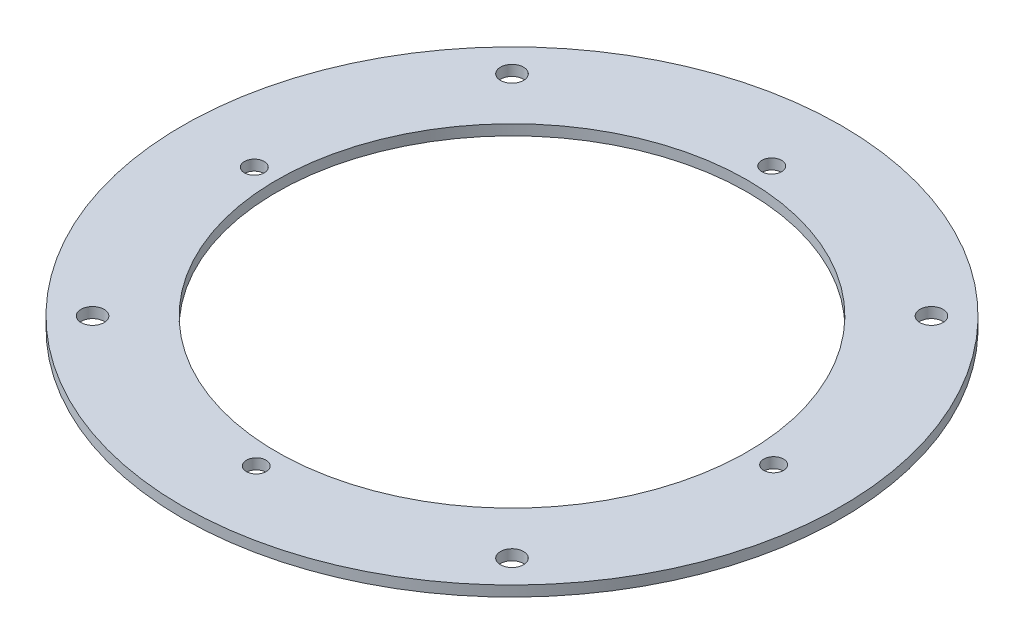
ISO-10303-21;
HEADER;
FILE_DESCRIPTION(('STEP AP214'),'2;1');
FILE_NAME('part.step','',(''),(''),'','','');
FILE_SCHEMA(('AUTOMOTIVE_DESIGN { 1 0 10303 214 1 1 1 1 }'));
ENDSEC;
DATA;
#1=APPLICATION_CONTEXT('core data for automotive mechanical design processes');
#2=APPLICATION_PROTOCOL_DEFINITION('international standard','automotive_design',2000,#1);
#3=PRODUCT_CONTEXT('',#1,'mechanical');
#4=PRODUCT('Part','Part','',(#3));
#5=PRODUCT_RELATED_PRODUCT_CATEGORY('part','',(#4));
#6=PRODUCT_DEFINITION_FORMATION('','',#4);
#7=PRODUCT_DEFINITION_CONTEXT('part definition',#1,'design');
#8=PRODUCT_DEFINITION('design','',#6,#7);
#9=PRODUCT_DEFINITION_SHAPE('','',#8);
#10=(LENGTH_UNIT() NAMED_UNIT(*) SI_UNIT(.MILLI.,.METRE.));
#11=(NAMED_UNIT(*) PLANE_ANGLE_UNIT() SI_UNIT($,.RADIAN.));
#12=(NAMED_UNIT(*) SI_UNIT($,.STERADIAN.) SOLID_ANGLE_UNIT());
#13=UNCERTAINTY_MEASURE_WITH_UNIT(LENGTH_MEASURE(1.E-05),#10,'distance_accuracy_value','');
#14=(GEOMETRIC_REPRESENTATION_CONTEXT(3) GLOBAL_UNCERTAINTY_ASSIGNED_CONTEXT((#13)) GLOBAL_UNIT_ASSIGNED_CONTEXT((#10,
#11,#12)) REPRESENTATION_CONTEXT('',''));
#15=CARTESIAN_POINT('',(0.,0.,0.));
#16=DIRECTION('',(0.,0.,1.));
#17=DIRECTION('',(1.,0.,0.));
#18=AXIS2_PLACEMENT_3D('',#15,#16,#17);
#19=CARTESIAN_POINT('',(0.,1.59,0.));
#20=DIRECTION('',(0.,1.,0.));
#21=DIRECTION('',(0.,0.,1.));
#22=AXIS2_PLACEMENT_3D('',#19,#20,#21);
#23=PLANE('',#22);
#24=CARTESIAN_POINT('',(31.8198103067884,1.59,-31.8198000000018));
#25=DIRECTION('',(0.,1.,0.));
#26=DIRECTION('',(0.,0.,1.));
#27=AXIS2_PLACEMENT_3D('',#24,#25,#26);
#28=CIRCLE('',#27,1.75000000000186);
#29=CARTESIAN_POINT('',(31.8198103067884,1.59,-30.0697999999999));
#30=VERTEX_POINT('',#29);
#31=EDGE_CURVE('E71',#30,#30,#28,.T.);
#32=ORIENTED_EDGE('',*,*,#31,.F.);
#33=EDGE_LOOP('',(#32));
#34=FACE_BOUND('',#33,.T.);
#35=CARTESIAN_POINT('',(31.8198000000018,1.59,31.8198103067866));
#36=DIRECTION('',(0.,1.,0.));
#37=DIRECTION('',(0.,0.,1.));
#38=AXIS2_PLACEMENT_3D('',#35,#36,#37);
#39=CIRCLE('',#38,1.75000000000253);
#40=CARTESIAN_POINT('',(31.8198000000018,1.59,33.5698103067892));
#41=VERTEX_POINT('',#40);
#42=EDGE_CURVE('E126',#41,#41,#39,.T.);
#43=ORIENTED_EDGE('',*,*,#42,.F.);
#44=EDGE_LOOP('',(#43));
#45=FACE_BOUND('',#44,.T.);
#46=CARTESIAN_POINT('',(-31.8198103067866,1.59,31.8198));
#47=DIRECTION('',(0.,1.,0.));
#48=DIRECTION('',(0.,0.,1.));
#49=AXIS2_PLACEMENT_3D('',#46,#47,#48);
#50=CIRCLE('',#49,1.75000000000097);
#51=CARTESIAN_POINT('',(-31.8198103067866,1.59,33.569800000001));
#52=VERTEX_POINT('',#51);
#53=EDGE_CURVE('E84',#52,#52,#50,.T.);
#54=ORIENTED_EDGE('',*,*,#53,.F.);
#55=EDGE_LOOP('',(#54));
#56=FACE_BOUND('',#55,.T.);
#57=CARTESIAN_POINT('',(-31.8198,1.59,-31.8198103067884));
#58=DIRECTION('',(0.,1.,0.));
#59=DIRECTION('',(0.,0.,1.));
#60=AXIS2_PLACEMENT_3D('',#57,#58,#59);
#61=CIRCLE('',#60,1.75);
#62=CARTESIAN_POINT('',(-31.8198,1.59,-30.0698103067884));
#63=VERTEX_POINT('',#62);
#64=EDGE_CURVE('E67',#63,#63,#61,.T.);
#65=ORIENTED_EDGE('',*,*,#64,.F.);
#66=EDGE_LOOP('',(#65));
#67=FACE_BOUND('',#66,.T.);
#68=CARTESIAN_POINT('',(39.4,1.59,-0.3000000000011));
#69=DIRECTION('',(0.,1.,0.));
#70=DIRECTION('',(0.,0.,1.));
#71=AXIS2_PLACEMENT_3D('',#68,#69,#70);
#72=CIRCLE('',#71,1.5);
#73=CARTESIAN_POINT('',(39.4,1.59,1.1999999999989));
#74=VERTEX_POINT('',#73);
#75=EDGE_CURVE('E57',#74,#74,#72,.T.);
#76=ORIENTED_EDGE('',*,*,#75,.F.);
#77=EDGE_LOOP('',(#76));
#78=FACE_BOUND('',#77,.T.);
#79=CARTESIAN_POINT('',(0.300000000001114,1.59,39.0999999999989));
#80=DIRECTION('',(0.,1.,0.));
#81=DIRECTION('',(0.,0.,1.));
#82=AXIS2_PLACEMENT_3D('',#79,#80,#81);
#83=CIRCLE('',#82,1.5);
#84=CARTESIAN_POINT('',(0.300000000001114,1.59,40.5999999999989));
#85=VERTEX_POINT('',#84);
#86=EDGE_CURVE('E88',#85,#85,#83,.T.);
#87=ORIENTED_EDGE('',*,*,#86,.F.);
#88=EDGE_LOOP('',(#87));
#89=FACE_BOUND('',#88,.T.);
#90=CARTESIAN_POINT('',(-39.0999999999989,1.59,0.));
#91=DIRECTION('',(0.,1.,0.));
#92=DIRECTION('',(0.,0.,1.));
#93=AXIS2_PLACEMENT_3D('',#90,#91,#92);
#94=CIRCLE('',#93,1.5);
#95=CARTESIAN_POINT('',(-39.0999999999989,1.59,1.5));
#96=VERTEX_POINT('',#95);
#97=EDGE_CURVE('E66',#96,#96,#94,.T.);
#98=ORIENTED_EDGE('',*,*,#97,.F.);
#99=EDGE_LOOP('',(#98));
#100=FACE_BOUND('',#99,.T.);
#101=CARTESIAN_POINT('',(0.,1.59,-39.4));
#102=DIRECTION('',(0.,1.,0.));
#103=DIRECTION('',(0.,0.,1.));
#104=AXIS2_PLACEMENT_3D('',#101,#102,#103);
#105=CIRCLE('',#104,1.5);
#106=CARTESIAN_POINT('',(0.,1.59,-37.9));
#107=VERTEX_POINT('',#106);
#108=EDGE_CURVE('E52',#107,#107,#105,.T.);
#109=ORIENTED_EDGE('',*,*,#108,.F.);
#110=EDGE_LOOP('',(#109));
#111=FACE_BOUND('',#110,.T.);
#112=CARTESIAN_POINT('',(0.,1.59,0.));
#113=DIRECTION('',(0.,1.,0.));
#114=DIRECTION('',(0.,0.,1.));
#115=AXIS2_PLACEMENT_3D('',#112,#113,#114);
#116=CIRCLE('',#115,50.);
#117=CARTESIAN_POINT('',(0.,1.59,-50.));
#118=VERTEX_POINT('',#117);
#119=EDGE_CURVE('E10',#118,#118,#116,.T.);
#120=ORIENTED_EDGE('',*,*,#119,.T.);
#121=EDGE_LOOP('',(#120));
#122=FACE_BOUND('',#121,.T.);
#123=CARTESIAN_POINT('',(0.,1.59,0.));
#124=DIRECTION('',(0.,1.,0.));
#125=DIRECTION('',(0.,0.,1.));
#126=AXIS2_PLACEMENT_3D('',#123,#124,#125);
#127=CIRCLE('',#126,35.715);
#128=CARTESIAN_POINT('',(0.,1.59,-35.715));
#129=VERTEX_POINT('',#128);
#130=EDGE_CURVE('E43',#129,#129,#127,.T.);
#131=ORIENTED_EDGE('',*,*,#130,.F.);
#132=EDGE_LOOP('',(#131));
#133=FACE_BOUND('',#132,.T.);
#134=ADVANCED_FACE('F30',(#34,#45,#56,#67,#78,#89,#100,#111,#122,#133),#23,.T.);
#135=CARTESIAN_POINT('',(0.,0.,0.));
#136=DIRECTION('',(0.,1.,0.));
#137=DIRECTION('',(0.,0.,1.));
#138=AXIS2_PLACEMENT_3D('',#135,#136,#137);
#139=PLANE('',#138);
#140=CARTESIAN_POINT('',(31.8198103067884,0.,-31.8198000000018));
#141=DIRECTION('',(0.,1.,0.));
#142=DIRECTION('',(0.,0.,1.));
#143=AXIS2_PLACEMENT_3D('',#140,#141,#142);
#144=CIRCLE('',#143,1.75000000000186);
#145=CARTESIAN_POINT('',(31.8198103067884,0.,-30.0697999999999));
#146=VERTEX_POINT('',#145);
#147=EDGE_CURVE('E34',#146,#146,#144,.T.);
#148=ORIENTED_EDGE('',*,*,#147,.T.);
#149=EDGE_LOOP('',(#148));
#150=FACE_BOUND('',#149,.T.);
#151=CARTESIAN_POINT('',(31.8198000000018,0.,31.8198103067866));
#152=DIRECTION('',(0.,1.,0.));
#153=DIRECTION('',(0.,0.,1.));
#154=AXIS2_PLACEMENT_3D('',#151,#152,#153);
#155=CIRCLE('',#154,1.75000000000253);
#156=CARTESIAN_POINT('',(31.8198000000018,0.,33.5698103067892));
#157=VERTEX_POINT('',#156);
#158=EDGE_CURVE('E70',#157,#157,#155,.T.);
#159=ORIENTED_EDGE('',*,*,#158,.T.);
#160=EDGE_LOOP('',(#159));
#161=FACE_BOUND('',#160,.T.);
#162=CARTESIAN_POINT('',(-31.8198103067866,0.,31.8198));
#163=DIRECTION('',(0.,1.,0.));
#164=DIRECTION('',(0.,0.,1.));
#165=AXIS2_PLACEMENT_3D('',#162,#163,#164);
#166=CIRCLE('',#165,1.75000000000097);
#167=CARTESIAN_POINT('',(-31.8198103067866,0.,33.569800000001));
#168=VERTEX_POINT('',#167);
#169=EDGE_CURVE('E68',#168,#168,#166,.T.);
#170=ORIENTED_EDGE('',*,*,#169,.T.);
#171=EDGE_LOOP('',(#170));
#172=FACE_BOUND('',#171,.T.);
#173=CARTESIAN_POINT('',(-31.8198,0.,-31.8198103067884));
#174=DIRECTION('',(0.,1.,0.));
#175=DIRECTION('',(0.,0.,1.));
#176=AXIS2_PLACEMENT_3D('',#173,#174,#175);
#177=CIRCLE('',#176,1.75);
#178=CARTESIAN_POINT('',(-31.8198,0.,-30.0698103067884));
#179=VERTEX_POINT('',#178);
#180=EDGE_CURVE('E63',#179,#179,#177,.T.);
#181=ORIENTED_EDGE('',*,*,#180,.T.);
#182=EDGE_LOOP('',(#181));
#183=FACE_BOUND('',#182,.T.);
#184=CARTESIAN_POINT('',(39.4,0.,-0.3000000000011));
#185=DIRECTION('',(0.,1.,0.));
#186=DIRECTION('',(0.,0.,1.));
#187=AXIS2_PLACEMENT_3D('',#184,#185,#186);
#188=CIRCLE('',#187,1.5);
#189=CARTESIAN_POINT('',(39.4,0.,1.1999999999989));
#190=VERTEX_POINT('',#189);
#191=EDGE_CURVE('E60',#190,#190,#188,.T.);
#192=ORIENTED_EDGE('',*,*,#191,.T.);
#193=EDGE_LOOP('',(#192));
#194=FACE_BOUND('',#193,.T.);
#195=CARTESIAN_POINT('',(0.300000000001114,0.,39.0999999999989));
#196=DIRECTION('',(0.,1.,0.));
#197=DIRECTION('',(0.,0.,1.));
#198=AXIS2_PLACEMENT_3D('',#195,#196,#197);
#199=CIRCLE('',#198,1.5);
#200=CARTESIAN_POINT('',(0.300000000001114,0.,40.5999999999989));
#201=VERTEX_POINT('',#200);
#202=EDGE_CURVE('E56',#201,#201,#199,.T.);
#203=ORIENTED_EDGE('',*,*,#202,.T.);
#204=EDGE_LOOP('',(#203));
#205=FACE_BOUND('',#204,.T.);
#206=CARTESIAN_POINT('',(-39.0999999999989,0.,0.));
#207=DIRECTION('',(0.,1.,0.));
#208=DIRECTION('',(0.,0.,1.));
#209=AXIS2_PLACEMENT_3D('',#206,#207,#208);
#210=CIRCLE('',#209,1.5);
#211=CARTESIAN_POINT('',(-39.0999999999989,0.,1.5));
#212=VERTEX_POINT('',#211);
#213=EDGE_CURVE('E53',#212,#212,#210,.T.);
#214=ORIENTED_EDGE('',*,*,#213,.T.);
#215=EDGE_LOOP('',(#214));
#216=FACE_BOUND('',#215,.T.);
#217=CARTESIAN_POINT('',(0.,0.,-39.4));
#218=DIRECTION('',(0.,1.,0.));
#219=DIRECTION('',(0.,0.,1.));
#220=AXIS2_PLACEMENT_3D('',#217,#218,#219);
#221=CIRCLE('',#220,1.5);
#222=CARTESIAN_POINT('',(0.,0.,-37.9));
#223=VERTEX_POINT('',#222);
#224=EDGE_CURVE('E49',#223,#223,#221,.T.);
#225=ORIENTED_EDGE('',*,*,#224,.T.);
#226=EDGE_LOOP('',(#225));
#227=FACE_BOUND('',#226,.T.);
#228=CARTESIAN_POINT('',(0.,0.,0.));
#229=DIRECTION('',(0.,1.,0.));
#230=DIRECTION('',(0.,0.,1.));
#231=AXIS2_PLACEMENT_3D('',#228,#229,#230);
#232=CIRCLE('',#231,50.);
#233=CARTESIAN_POINT('',(0.,0.,-50.));
#234=VERTEX_POINT('',#233);
#235=EDGE_CURVE('E38',#234,#234,#232,.T.);
#236=ORIENTED_EDGE('',*,*,#235,.F.);
#237=EDGE_LOOP('',(#236));
#238=FACE_BOUND('',#237,.T.);
#239=CARTESIAN_POINT('',(0.,0.,0.));
#240=DIRECTION('',(0.,1.,0.));
#241=DIRECTION('',(0.,0.,1.));
#242=AXIS2_PLACEMENT_3D('',#239,#240,#241);
#243=CIRCLE('',#242,35.715);
#244=CARTESIAN_POINT('',(0.,0.,-35.715));
#245=VERTEX_POINT('',#244);
#246=EDGE_CURVE('E46',#245,#245,#243,.T.);
#247=ORIENTED_EDGE('',*,*,#246,.T.);
#248=EDGE_LOOP('',(#247));
#249=FACE_BOUND('',#248,.T.);
#250=ADVANCED_FACE('F100',(#150,#161,#172,#183,#194,#205,#216,#227,#238,#249),#139,.F.);
#251=CARTESIAN_POINT('',(0.,1.59,0.));
#252=DIRECTION('',(0.,-1.,0.));
#253=DIRECTION('',(0.,0.,-1.));
#254=AXIS2_PLACEMENT_3D('',#251,#252,#253);
#255=CYLINDRICAL_SURFACE('',#254,50.);
#256=CARTESIAN_POINT('',(0.,1.59,-50.));
#257=CARTESIAN_POINT('',(0.,1.5734375,-50.));
#258=CARTESIAN_POINT('',(0.,1.556875,-50.));
#259=CARTESIAN_POINT('',(0.,1.52375,-50.));
#260=CARTESIAN_POINT('',(0.,1.5071875,-50.));
#261=CARTESIAN_POINT('',(0.,1.4740625,-50.));
#262=CARTESIAN_POINT('',(0.,1.4575,-50.));
#263=CARTESIAN_POINT('',(0.,1.424375,-50.));
#264=CARTESIAN_POINT('',(0.,1.4078125,-50.));
#265=CARTESIAN_POINT('',(0.,1.3746875,-50.));
#266=CARTESIAN_POINT('',(0.,1.358125,-50.));
#267=CARTESIAN_POINT('',(0.,1.325,-50.));
#268=CARTESIAN_POINT('',(0.,1.3084375,-50.));
#269=CARTESIAN_POINT('',(0.,1.2753125,-50.));
#270=CARTESIAN_POINT('',(0.,1.25875,-50.));
#271=CARTESIAN_POINT('',(0.,1.225625,-50.));
#272=CARTESIAN_POINT('',(0.,1.2090625,-50.));
#273=CARTESIAN_POINT('',(0.,1.1759375,-50.));
#274=CARTESIAN_POINT('',(0.,1.159375,-50.));
#275=CARTESIAN_POINT('',(0.,1.12625,-50.));
#276=CARTESIAN_POINT('',(0.,1.1096875,-50.));
#277=CARTESIAN_POINT('',(0.,1.0765625,-50.));
#278=CARTESIAN_POINT('',(0.,1.06,-50.));
#279=CARTESIAN_POINT('',(0.,1.026875,-50.));
#280=CARTESIAN_POINT('',(0.,1.0103125,-50.));
#281=CARTESIAN_POINT('',(0.,0.9771875,-50.));
#282=CARTESIAN_POINT('',(0.,0.960625,-50.));
#283=CARTESIAN_POINT('',(0.,0.9275,-50.));
#284=CARTESIAN_POINT('',(0.,0.9109375,-50.));
#285=CARTESIAN_POINT('',(0.,0.8778125,-50.));
#286=CARTESIAN_POINT('',(0.,0.86125,-50.));
#287=CARTESIAN_POINT('',(0.,0.828125,-50.));
#288=CARTESIAN_POINT('',(0.,0.8115625,-50.));
#289=CARTESIAN_POINT('',(0.,0.7784375,-50.));
#290=CARTESIAN_POINT('',(0.,0.761875,-50.));
#291=CARTESIAN_POINT('',(0.,0.72875,-50.));
#292=CARTESIAN_POINT('',(0.,0.7121875,-50.));
#293=CARTESIAN_POINT('',(0.,0.6790625,-50.));
#294=CARTESIAN_POINT('',(0.,0.6625,-50.));
#295=CARTESIAN_POINT('',(0.,0.629375,-50.));
#296=CARTESIAN_POINT('',(0.,0.6128125,-50.));
#297=CARTESIAN_POINT('',(0.,0.5796875,-50.));
#298=CARTESIAN_POINT('',(0.,0.563125,-50.));
#299=CARTESIAN_POINT('',(0.,0.53,-50.));
#300=CARTESIAN_POINT('',(0.,0.5134375,-50.));
#301=CARTESIAN_POINT('',(0.,0.4803125,-50.));
#302=CARTESIAN_POINT('',(0.,0.46375,-50.));
#303=CARTESIAN_POINT('',(0.,0.430625,-50.));
#304=CARTESIAN_POINT('',(0.,0.4140625,-50.));
#305=CARTESIAN_POINT('',(0.,0.3809375,-50.));
#306=CARTESIAN_POINT('',(0.,0.364375,-50.));
#307=CARTESIAN_POINT('',(0.,0.33125,-50.));
#308=CARTESIAN_POINT('',(0.,0.3146875,-50.));
#309=CARTESIAN_POINT('',(0.,0.2815625,-50.));
#310=CARTESIAN_POINT('',(0.,0.265,-50.));
#311=CARTESIAN_POINT('',(0.,0.231875,-50.));
#312=CARTESIAN_POINT('',(0.,0.2153125,-50.));
#313=CARTESIAN_POINT('',(0.,0.1821875,-50.));
#314=CARTESIAN_POINT('',(0.,0.165625,-50.));
#315=CARTESIAN_POINT('',(0.,0.1325,-50.));
#316=CARTESIAN_POINT('',(0.,0.1159375,-50.));
#317=CARTESIAN_POINT('',(0.,0.0828125000000001,-50.));
#318=CARTESIAN_POINT('',(0.,0.06625,-50.));
#319=CARTESIAN_POINT('',(0.,0.033125,-50.));
#320=CARTESIAN_POINT('',(0.,0.0165625,-50.));
#321=CARTESIAN_POINT('',(0.,0.,-50.));
#322=B_SPLINE_CURVE_WITH_KNOTS('',3,(#256,#257,#258,#259,#260,#261,#262,#263,#264,#265,#266,
#267,#268,#269,#270,#271,#272,#273,#274,#275,#276,#277,#278,#279,#280,#281,#282,#283,#284,#285,
#286,#287,#288,#289,#290,#291,#292,#293,#294,#295,#296,#297,#298,#299,#300,#301,#302,#303,#304,
#305,#306,#307,#308,#309,#310,#311,#312,#313,#314,#315,#316,#317,#318,#319,#320,#321),
.UNSPECIFIED.,.F.,.F.,(4,2,2,2,2,2,2,2,2,2,2,2,2,2,2,2,2,2,2,2,2,2,2,2,2,2,2,2,2,2,2,2,4),(0.,
0.0496875,0.0993750000000001,0.1490625,0.19875,0.2484375,0.298125,0.3478125,0.3975,0.4471875,
0.496875,0.5465625,0.59625,0.6459375,0.695625,0.7453125,0.795,0.8446875,0.894375,0.9440625,
0.99375,1.0434375,1.093125,1.1428125,1.1925,1.2421875,1.291875,1.3415625,1.39125,1.4409375,
1.490625,1.5403125,1.59),.UNSPECIFIED.);
#323=EDGE_CURVE('BSEAM32',#118,#234,#322,.T.);
#324=ORIENTED_EDGE('',*,*,#119,.F.);
#325=ORIENTED_EDGE('',*,*,#235,.T.);
#326=ORIENTED_EDGE('',*,*,#323,.T.);
#327=ORIENTED_EDGE('',*,*,#323,.F.);
#328=EDGE_LOOP('',(#324,#326,#325,#327));
#329=FACE_BOUND('',#328,.T.);
#330=ADVANCED_FACE('F32',(#329),#255,.T.);
#331=CARTESIAN_POINT('',(0.,1.59,0.));
#332=DIRECTION('',(0.,-1.,0.));
#333=DIRECTION('',(0.,0.,-1.));
#334=AXIS2_PLACEMENT_3D('',#331,#332,#333);
#335=CYLINDRICAL_SURFACE('',#334,35.715);
#336=CARTESIAN_POINT('',(0.,1.59,-35.715));
#337=CARTESIAN_POINT('',(0.,1.5734375,-35.715));
#338=CARTESIAN_POINT('',(0.,1.556875,-35.715));
#339=CARTESIAN_POINT('',(0.,1.52375,-35.715));
#340=CARTESIAN_POINT('',(0.,1.5071875,-35.715));
#341=CARTESIAN_POINT('',(0.,1.4740625,-35.715));
#342=CARTESIAN_POINT('',(0.,1.4575,-35.715));
#343=CARTESIAN_POINT('',(0.,1.424375,-35.715));
#344=CARTESIAN_POINT('',(0.,1.4078125,-35.715));
#345=CARTESIAN_POINT('',(0.,1.3746875,-35.715));
#346=CARTESIAN_POINT('',(0.,1.358125,-35.715));
#347=CARTESIAN_POINT('',(0.,1.325,-35.715));
#348=CARTESIAN_POINT('',(0.,1.3084375,-35.715));
#349=CARTESIAN_POINT('',(0.,1.2753125,-35.715));
#350=CARTESIAN_POINT('',(0.,1.25875,-35.715));
#351=CARTESIAN_POINT('',(0.,1.225625,-35.715));
#352=CARTESIAN_POINT('',(0.,1.2090625,-35.715));
#353=CARTESIAN_POINT('',(0.,1.1759375,-35.715));
#354=CARTESIAN_POINT('',(0.,1.159375,-35.715));
#355=CARTESIAN_POINT('',(0.,1.12625,-35.715));
#356=CARTESIAN_POINT('',(0.,1.1096875,-35.715));
#357=CARTESIAN_POINT('',(0.,1.0765625,-35.715));
#358=CARTESIAN_POINT('',(0.,1.06,-35.715));
#359=CARTESIAN_POINT('',(0.,1.026875,-35.715));
#360=CARTESIAN_POINT('',(0.,1.0103125,-35.715));
#361=CARTESIAN_POINT('',(0.,0.9771875,-35.715));
#362=CARTESIAN_POINT('',(0.,0.960625,-35.715));
#363=CARTESIAN_POINT('',(0.,0.9275,-35.715));
#364=CARTESIAN_POINT('',(0.,0.9109375,-35.715));
#365=CARTESIAN_POINT('',(0.,0.8778125,-35.715));
#366=CARTESIAN_POINT('',(0.,0.86125,-35.715));
#367=CARTESIAN_POINT('',(0.,0.828125,-35.715));
#368=CARTESIAN_POINT('',(0.,0.8115625,-35.715));
#369=CARTESIAN_POINT('',(0.,0.7784375,-35.715));
#370=CARTESIAN_POINT('',(0.,0.761875,-35.715));
#371=CARTESIAN_POINT('',(0.,0.72875,-35.715));
#372=CARTESIAN_POINT('',(0.,0.7121875,-35.715));
#373=CARTESIAN_POINT('',(0.,0.6790625,-35.715));
#374=CARTESIAN_POINT('',(0.,0.6625,-35.715));
#375=CARTESIAN_POINT('',(0.,0.629375,-35.715));
#376=CARTESIAN_POINT('',(0.,0.6128125,-35.715));
#377=CARTESIAN_POINT('',(0.,0.5796875,-35.715));
#378=CARTESIAN_POINT('',(0.,0.563125,-35.715));
#379=CARTESIAN_POINT('',(0.,0.53,-35.715));
#380=CARTESIAN_POINT('',(0.,0.5134375,-35.715));
#381=CARTESIAN_POINT('',(0.,0.4803125,-35.715));
#382=CARTESIAN_POINT('',(0.,0.46375,-35.715));
#383=CARTESIAN_POINT('',(0.,0.430625,-35.715));
#384=CARTESIAN_POINT('',(0.,0.4140625,-35.715));
#385=CARTESIAN_POINT('',(0.,0.3809375,-35.715));
#386=CARTESIAN_POINT('',(0.,0.364375,-35.715));
#387=CARTESIAN_POINT('',(0.,0.33125,-35.715));
#388=CARTESIAN_POINT('',(0.,0.3146875,-35.715));
#389=CARTESIAN_POINT('',(0.,0.2815625,-35.715));
#390=CARTESIAN_POINT('',(0.,0.265,-35.715));
#391=CARTESIAN_POINT('',(0.,0.231875,-35.715));
#392=CARTESIAN_POINT('',(0.,0.2153125,-35.715));
#393=CARTESIAN_POINT('',(0.,0.1821875,-35.715));
#394=CARTESIAN_POINT('',(0.,0.165625,-35.715));
#395=CARTESIAN_POINT('',(0.,0.1325,-35.715));
#396=CARTESIAN_POINT('',(0.,0.1159375,-35.715));
#397=CARTESIAN_POINT('',(0.,0.0828125000000001,-35.715));
#398=CARTESIAN_POINT('',(0.,0.06625,-35.715));
#399=CARTESIAN_POINT('',(0.,0.033125,-35.715));
#400=CARTESIAN_POINT('',(0.,0.0165625,-35.715));
#401=CARTESIAN_POINT('',(0.,0.,-35.715));
#402=B_SPLINE_CURVE_WITH_KNOTS('',3,(#336,#337,#338,#339,#340,#341,#342,#343,#344,#345,#346,
#347,#348,#349,#350,#351,#352,#353,#354,#355,#356,#357,#358,#359,#360,#361,#362,#363,#364,#365,
#366,#367,#368,#369,#370,#371,#372,#373,#374,#375,#376,#377,#378,#379,#380,#381,#382,#383,#384,
#385,#386,#387,#388,#389,#390,#391,#392,#393,#394,#395,#396,#397,#398,#399,#400,#401),
.UNSPECIFIED.,.F.,.F.,(4,2,2,2,2,2,2,2,2,2,2,2,2,2,2,2,2,2,2,2,2,2,2,2,2,2,2,2,2,2,2,2,4),(0.,
0.0496874999999998,0.0993749999999999,0.1490625,0.19875,0.2484375,0.298125,0.3478125,0.3975,
0.4471875,0.496875,0.5465625,0.59625,0.6459375,0.695625,0.7453125,0.795,0.8446875,0.894375,
0.9440625,0.99375,1.0434375,1.093125,1.1428125,1.1925,1.2421875,1.291875,1.3415625,1.39125,
1.4409375,1.490625,1.5403125,1.59),.UNSPECIFIED.);
#403=EDGE_CURVE('BSEAM102',#129,#245,#402,.T.);
#404=ORIENTED_EDGE('',*,*,#130,.T.);
#405=ORIENTED_EDGE('',*,*,#246,.F.);
#406=ORIENTED_EDGE('',*,*,#403,.T.);
#407=ORIENTED_EDGE('',*,*,#403,.F.);
#408=EDGE_LOOP('',(#404,#406,#405,#407));
#409=FACE_BOUND('',#408,.T.);
#410=ADVANCED_FACE('F102',(#409),#335,.F.);
#411=CARTESIAN_POINT('',(0.,-0.41,-39.4));
#412=DIRECTION('',(0.,1.,0.));
#413=DIRECTION('',(0.,0.,1.));
#414=AXIS2_PLACEMENT_3D('',#411,#412,#413);
#415=CYLINDRICAL_SURFACE('',#414,1.5);
#416=ORIENTED_EDGE('',*,*,#108,.T.);
#417=EDGE_LOOP('',(#416));
#418=FACE_BOUND('',#417,.T.);
#419=ORIENTED_EDGE('',*,*,#224,.F.);
#420=EDGE_LOOP('',(#419));
#421=FACE_BOUND('',#420,.T.);
#422=ADVANCED_FACE('F104',(#418,#421),#415,.F.);
#423=CARTESIAN_POINT('',(-39.0999999999989,-0.41,0.));
#424=DIRECTION('',(0.,1.,0.));
#425=DIRECTION('',(0.,0.,1.));
#426=AXIS2_PLACEMENT_3D('',#423,#424,#425);
#427=CYLINDRICAL_SURFACE('',#426,1.5);
#428=ORIENTED_EDGE('',*,*,#97,.T.);
#429=EDGE_LOOP('',(#428));
#430=FACE_BOUND('',#429,.T.);
#431=ORIENTED_EDGE('',*,*,#213,.F.);
#432=EDGE_LOOP('',(#431));
#433=FACE_BOUND('',#432,.T.);
#434=ADVANCED_FACE('F110',(#430,#433),#427,.F.);
#435=CARTESIAN_POINT('',(0.300000000001114,-0.41,39.0999999999989));
#436=DIRECTION('',(0.,1.,0.));
#437=DIRECTION('',(0.,0.,1.));
#438=AXIS2_PLACEMENT_3D('',#435,#436,#437);
#439=CYLINDRICAL_SURFACE('',#438,1.5);
#440=ORIENTED_EDGE('',*,*,#86,.T.);
#441=EDGE_LOOP('',(#440));
#442=FACE_BOUND('',#441,.T.);
#443=ORIENTED_EDGE('',*,*,#202,.F.);
#444=EDGE_LOOP('',(#443));
#445=FACE_BOUND('',#444,.T.);
#446=ADVANCED_FACE('F148',(#442,#445),#439,.F.);
#447=CARTESIAN_POINT('',(39.4,-0.41,-0.3000000000011));
#448=DIRECTION('',(0.,1.,0.));
#449=DIRECTION('',(0.,0.,1.));
#450=AXIS2_PLACEMENT_3D('',#447,#448,#449);
#451=CYLINDRICAL_SURFACE('',#450,1.5);
#452=ORIENTED_EDGE('',*,*,#75,.T.);
#453=EDGE_LOOP('',(#452));
#454=FACE_BOUND('',#453,.T.);
#455=ORIENTED_EDGE('',*,*,#191,.F.);
#456=EDGE_LOOP('',(#455));
#457=FACE_BOUND('',#456,.T.);
#458=ADVANCED_FACE('F155',(#454,#457),#451,.F.);
#459=CARTESIAN_POINT('',(-31.8198,-0.41,-31.8198103067884));
#460=DIRECTION('',(0.,1.,0.));
#461=DIRECTION('',(0.,0.,1.));
#462=AXIS2_PLACEMENT_3D('',#459,#460,#461);
#463=CYLINDRICAL_SURFACE('',#462,1.75);
#464=ORIENTED_EDGE('',*,*,#64,.T.);
#465=EDGE_LOOP('',(#464));
#466=FACE_BOUND('',#465,.T.);
#467=ORIENTED_EDGE('',*,*,#180,.F.);
#468=EDGE_LOOP('',(#467));
#469=FACE_BOUND('',#468,.T.);
#470=ADVANCED_FACE('F161',(#466,#469),#463,.F.);
#471=CARTESIAN_POINT('',(-31.8198103067866,-0.41,31.8198));
#472=DIRECTION('',(0.,1.,0.));
#473=DIRECTION('',(0.,0.,1.));
#474=AXIS2_PLACEMENT_3D('',#471,#472,#473);
#475=CYLINDRICAL_SURFACE('',#474,1.75000000000097);
#476=ORIENTED_EDGE('',*,*,#53,.T.);
#477=EDGE_LOOP('',(#476));
#478=FACE_BOUND('',#477,.T.);
#479=ORIENTED_EDGE('',*,*,#169,.F.);
#480=EDGE_LOOP('',(#479));
#481=FACE_BOUND('',#480,.T.);
#482=ADVANCED_FACE('F165',(#478,#481),#475,.F.);
#483=CARTESIAN_POINT('',(31.8198000000018,-0.41,31.8198103067866));
#484=DIRECTION('',(0.,1.,0.));
#485=DIRECTION('',(0.,0.,1.));
#486=AXIS2_PLACEMENT_3D('',#483,#484,#485);
#487=CYLINDRICAL_SURFACE('',#486,1.75000000000253);
#488=ORIENTED_EDGE('',*,*,#42,.T.);
#489=EDGE_LOOP('',(#488));
#490=FACE_BOUND('',#489,.T.);
#491=ORIENTED_EDGE('',*,*,#158,.F.);
#492=EDGE_LOOP('',(#491));
#493=FACE_BOUND('',#492,.T.);
#494=ADVANCED_FACE('F168',(#490,#493),#487,.F.);
#495=CARTESIAN_POINT('',(31.8198103067884,-0.41,-31.8198000000018));
#496=DIRECTION('',(0.,1.,0.));
#497=DIRECTION('',(0.,0.,1.));
#498=AXIS2_PLACEMENT_3D('',#495,#496,#497);
#499=CYLINDRICAL_SURFACE('',#498,1.75000000000186);
#500=ORIENTED_EDGE('',*,*,#31,.T.);
#501=EDGE_LOOP('',(#500));
#502=FACE_BOUND('',#501,.T.);
#503=ORIENTED_EDGE('',*,*,#147,.F.);
#504=EDGE_LOOP('',(#503));
#505=FACE_BOUND('',#504,.T.);
#506=ADVANCED_FACE('F172',(#502,#505),#499,.F.);
#507=CLOSED_SHELL('',(#134,#250,#330,#410,#422,#434,#446,#458,#470,#482,#494,#506));
#508=MANIFOLD_SOLID_BREP('B2',#507);
#509=ADVANCED_BREP_SHAPE_REPRESENTATION('',(#18,#508),#14);
#510=SHAPE_DEFINITION_REPRESENTATION(#9,#509);
ENDSEC;
END-ISO-10303-21;
